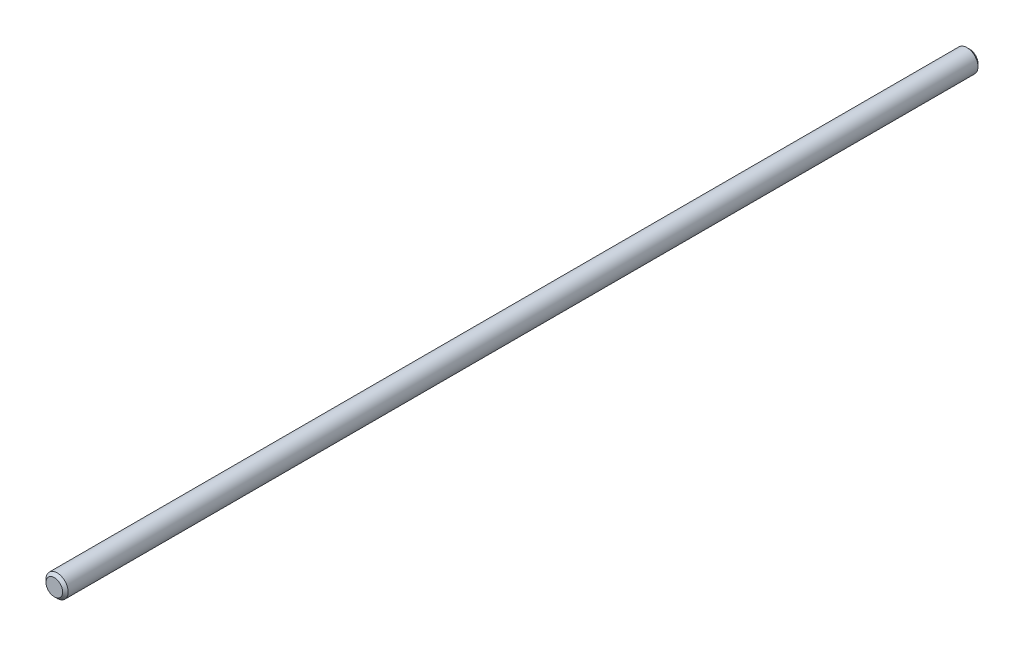
ISO-10303-21;
HEADER;
FILE_DESCRIPTION(('STEP AP214'),'2;1');
FILE_NAME('part.step','',(''),(''),'','','');
FILE_SCHEMA(('AUTOMOTIVE_DESIGN { 1 0 10303 214 1 1 1 1 }'));
ENDSEC;
DATA;
#1=APPLICATION_CONTEXT('core data for automotive mechanical design processes');
#2=APPLICATION_PROTOCOL_DEFINITION('international standard','automotive_design',2000,#1);
#3=PRODUCT_CONTEXT('',#1,'mechanical');
#4=PRODUCT('Part','Part','',(#3));
#5=PRODUCT_RELATED_PRODUCT_CATEGORY('part','',(#4));
#6=PRODUCT_DEFINITION_FORMATION('','',#4);
#7=PRODUCT_DEFINITION_CONTEXT('part definition',#1,'design');
#8=PRODUCT_DEFINITION('design','',#6,#7);
#9=PRODUCT_DEFINITION_SHAPE('','',#8);
#10=(LENGTH_UNIT() NAMED_UNIT(*) SI_UNIT(.MILLI.,.METRE.));
#11=(NAMED_UNIT(*) PLANE_ANGLE_UNIT() SI_UNIT($,.RADIAN.));
#12=(NAMED_UNIT(*) SI_UNIT($,.STERADIAN.) SOLID_ANGLE_UNIT());
#13=UNCERTAINTY_MEASURE_WITH_UNIT(LENGTH_MEASURE(1.E-05),#10,'distance_accuracy_value','');
#14=(GEOMETRIC_REPRESENTATION_CONTEXT(3) GLOBAL_UNCERTAINTY_ASSIGNED_CONTEXT((#13)) GLOBAL_UNIT_ASSIGNED_CONTEXT((#10,
#11,#12)) REPRESENTATION_CONTEXT('',''));
#15=CARTESIAN_POINT('',(0.,0.,0.));
#16=DIRECTION('',(0.,0.,1.));
#17=DIRECTION('',(1.,0.,0.));
#18=AXIS2_PLACEMENT_3D('',#15,#16,#17);
#19=CARTESIAN_POINT('',(0.,0.,330.));
#20=DIRECTION('',(0.,0.,-1.));
#21=DIRECTION('',(-1.,0.,0.));
#22=AXIS2_PLACEMENT_3D('',#19,#20,#21);
#23=CYLINDRICAL_SURFACE('',#22,4.);
#24=CARTESIAN_POINT('',(0.,0.,329.));
#25=DIRECTION('',(0.,0.,1.));
#26=DIRECTION('',(1.,0.,0.));
#27=AXIS2_PLACEMENT_3D('',#24,#25,#26);
#28=CIRCLE('',#27,4.);
#29=CARTESIAN_POINT('',(4.,0.,329.));
#30=VERTEX_POINT('',#29);
#31=EDGE_CURVE('E38',#30,#30,#28,.F.);
#32=ORIENTED_EDGE('',*,*,#31,.T.);
#33=EDGE_LOOP('',(#32));
#34=FACE_BOUND('',#33,.T.);
#35=CARTESIAN_POINT('',(0.,0.,1.));
#36=DIRECTION('',(0.,0.,1.));
#37=DIRECTION('',(1.,0.,0.));
#38=AXIS2_PLACEMENT_3D('',#35,#36,#37);
#39=CIRCLE('',#38,4.);
#40=CARTESIAN_POINT('',(4.,0.,1.));
#41=VERTEX_POINT('',#40);
#42=EDGE_CURVE('E42',#41,#41,#39,.T.);
#43=ORIENTED_EDGE('',*,*,#42,.T.);
#44=EDGE_LOOP('',(#43));
#45=FACE_BOUND('',#44,.T.);
#46=ADVANCED_FACE('F31',(#34,#45),#23,.T.);
#47=CARTESIAN_POINT('',(0.,0.,330.));
#48=DIRECTION('',(0.,0.,1.));
#49=DIRECTION('',(1.,0.,0.));
#50=AXIS2_PLACEMENT_3D('',#47,#48,#49);
#51=PLANE('',#50);
#52=CARTESIAN_POINT('',(0.,0.,330.));
#53=DIRECTION('',(0.,0.,1.));
#54=DIRECTION('',(1.,0.,0.));
#55=AXIS2_PLACEMENT_3D('',#52,#53,#54);
#56=CIRCLE('',#55,3.00000000000003);
#57=CARTESIAN_POINT('',(3.00000000000003,0.,330.));
#58=VERTEX_POINT('',#57);
#59=EDGE_CURVE('E46',#58,#58,#56,.T.);
#60=ORIENTED_EDGE('',*,*,#59,.T.);
#61=EDGE_LOOP('',(#60));
#62=FACE_BOUND('',#61,.T.);
#63=ADVANCED_FACE('F52',(#62),#51,.T.);
#64=CARTESIAN_POINT('',(0.,0.,0.));
#65=DIRECTION('',(0.,0.,1.));
#66=DIRECTION('',(1.,0.,0.));
#67=AXIS2_PLACEMENT_3D('',#64,#65,#66);
#68=PLANE('',#67);
#69=CARTESIAN_POINT('',(0.,0.,0.));
#70=DIRECTION('',(0.,0.,1.));
#71=DIRECTION('',(1.,0.,0.));
#72=AXIS2_PLACEMENT_3D('',#69,#70,#71);
#73=CIRCLE('',#72,3.);
#74=CARTESIAN_POINT('',(3.,0.,0.));
#75=VERTEX_POINT('',#74);
#76=EDGE_CURVE('E10',#75,#75,#73,.F.);
#77=ORIENTED_EDGE('',*,*,#76,.T.);
#78=EDGE_LOOP('',(#77));
#79=FACE_BOUND('',#78,.T.);
#80=ADVANCED_FACE('F56',(#79),#68,.F.);
#81=CARTESIAN_POINT('',(0.,0.,330.));
#82=DIRECTION('',(0.,0.,-1.));
#83=DIRECTION('',(-1.,0.,0.));
#84=AXIS2_PLACEMENT_3D('',#81,#82,#83);
#85=CONICAL_SURFACE('',#84,3.00000000000003,0.785398163397488);
#86=ORIENTED_EDGE('',*,*,#31,.F.);
#87=EDGE_LOOP('',(#86));
#88=FACE_BOUND('',#87,.T.);
#89=ORIENTED_EDGE('',*,*,#59,.F.);
#90=EDGE_LOOP('',(#89));
#91=FACE_BOUND('',#90,.T.);
#92=ADVANCED_FACE('F54',(#88,#91),#85,.T.);
#93=CARTESIAN_POINT('',(0.,0.,1.));
#94=DIRECTION('',(0.,0.,1.));
#95=DIRECTION('',(1.,0.,0.));
#96=AXIS2_PLACEMENT_3D('',#93,#94,#95);
#97=CONICAL_SURFACE('',#96,4.,0.785398163397447);
#98=ORIENTED_EDGE('',*,*,#76,.F.);
#99=EDGE_LOOP('',(#98));
#100=FACE_BOUND('',#99,.T.);
#101=ORIENTED_EDGE('',*,*,#42,.F.);
#102=EDGE_LOOP('',(#101));
#103=FACE_BOUND('',#102,.T.);
#104=ADVANCED_FACE('F33',(#100,#103),#97,.T.);
#105=CLOSED_SHELL('',(#46,#63,#80,#92,#104));
#106=MANIFOLD_SOLID_BREP('B2',#105);
#107=ADVANCED_BREP_SHAPE_REPRESENTATION('',(#18,#106),#14);
#108=SHAPE_DEFINITION_REPRESENTATION(#9,#107);
ENDSEC;
END-ISO-10303-21;
